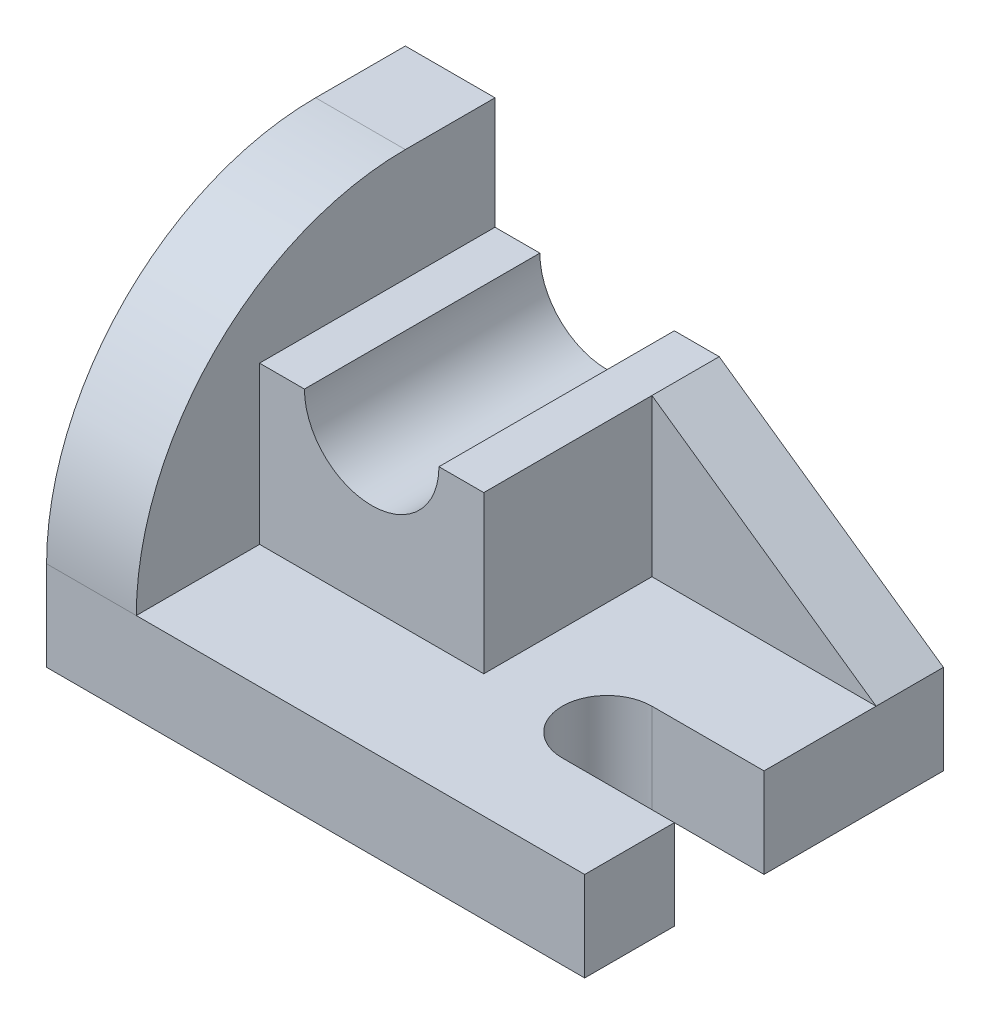
ISO-10303-21;
HEADER;
FILE_DESCRIPTION(('STEP AP214'),'2;1');
FILE_NAME('part.step','',(''),(''),'','','');
FILE_SCHEMA(('AUTOMOTIVE_DESIGN { 1 0 10303 214 1 1 1 1 }'));
ENDSEC;
DATA;
#1=APPLICATION_CONTEXT('core data for automotive mechanical design processes');
#2=APPLICATION_PROTOCOL_DEFINITION('international standard','automotive_design',2000,#1);
#3=PRODUCT_CONTEXT('',#1,'mechanical');
#4=PRODUCT('Part','Part','',(#3));
#5=PRODUCT_RELATED_PRODUCT_CATEGORY('part','',(#4));
#6=PRODUCT_DEFINITION_FORMATION('','',#4);
#7=PRODUCT_DEFINITION_CONTEXT('part definition',#1,'design');
#8=PRODUCT_DEFINITION('design','',#6,#7);
#9=PRODUCT_DEFINITION_SHAPE('','',#8);
#10=(LENGTH_UNIT() NAMED_UNIT(*) SI_UNIT(.MILLI.,.METRE.));
#11=(NAMED_UNIT(*) PLANE_ANGLE_UNIT() SI_UNIT($,.RADIAN.));
#12=(NAMED_UNIT(*) SI_UNIT($,.STERADIAN.) SOLID_ANGLE_UNIT());
#13=UNCERTAINTY_MEASURE_WITH_UNIT(LENGTH_MEASURE(1.E-05),#10,'distance_accuracy_value','');
#14=(GEOMETRIC_REPRESENTATION_CONTEXT(3) GLOBAL_UNCERTAINTY_ASSIGNED_CONTEXT((#13)) GLOBAL_UNIT_ASSIGNED_CONTEXT((#10,
#11,#12)) REPRESENTATION_CONTEXT('',''));
#15=CARTESIAN_POINT('',(0.,0.,0.));
#16=DIRECTION('',(0.,0.,1.));
#17=DIRECTION('',(1.,0.,0.));
#18=AXIS2_PLACEMENT_3D('',#15,#16,#17);
#19=CARTESIAN_POINT('',(0.,44.,0.));
#20=DIRECTION('',(0.,1.,0.));
#21=DIRECTION('',(0.,0.,1.));
#22=AXIS2_PLACEMENT_3D('',#19,#20,#21);
#23=PLANE('',#22);
#24=DIRECTION('',(0.,0.,1.));
#25=VECTOR('',#24,1.);
#26=CARTESIAN_POINT('',(24.,44.,-68.));
#27=LINE('',#26,#25);
#28=CARTESIAN_POINT('',(24.,44.,-64.));
#29=VERTEX_POINT('',#28);
#30=CARTESIAN_POINT('',(24.,44.,-22.));
#31=VERTEX_POINT('',#30);
#32=EDGE_CURVE('E11',#29,#31,#27,.T.);
#33=ORIENTED_EDGE('',*,*,#32,.F.);
#34=DIRECTION('',(-1.,0.,0.));
#35=VECTOR('',#34,1.);
#36=CARTESIAN_POINT('',(16.,44.,-64.));
#37=LINE('',#36,#35);
#38=CARTESIAN_POINT('',(16.,44.,-64.));
#39=VERTEX_POINT('',#38);
#40=EDGE_CURVE('E195',#29,#39,#37,.T.);
#41=ORIENTED_EDGE('',*,*,#40,.T.);
#42=DIRECTION('',(0.,0.,1.));
#43=VECTOR('',#42,1.);
#44=CARTESIAN_POINT('',(16.,44.,-64.));
#45=LINE('',#44,#43);
#46=CARTESIAN_POINT('',(16.,44.,-22.));
#47=VERTEX_POINT('',#46);
#48=EDGE_CURVE('E214',#39,#47,#45,.T.);
#49=ORIENTED_EDGE('',*,*,#48,.T.);
#50=DIRECTION('',(1.,0.,0.));
#51=VECTOR('',#50,1.);
#52=CARTESIAN_POINT('',(16.,44.,-22.));
#53=LINE('',#52,#51);
#54=EDGE_CURVE('E196',#47,#31,#53,.T.);
#55=ORIENTED_EDGE('',*,*,#54,.T.);
#56=EDGE_LOOP('',(#33,#41,#49,#55));
#57=FACE_BOUND('',#56,.T.);
#58=ADVANCED_FACE('F45',(#57),#23,.T.);
#59=CARTESIAN_POINT('',(0.,16.,0.));
#60=DIRECTION('',(0.,-1.,0.));
#61=DIRECTION('',(0.,0.,-1.));
#62=AXIS2_PLACEMENT_3D('',#59,#60,#61);
#63=PLANE('',#62);
#64=DIRECTION('',(0.,0.,-1.));
#65=VECTOR('',#64,1.);
#66=CARTESIAN_POINT('',(96.,16.,0.));
#67=LINE('',#66,#65);
#68=CARTESIAN_POINT('',(96.,16.,-32.));
#69=VERTEX_POINT('',#68);
#70=CARTESIAN_POINT('',(96.,16.,-52.));
#71=VERTEX_POINT('',#70);
#72=EDGE_CURVE('E292',#69,#71,#67,.T.);
#73=ORIENTED_EDGE('',*,*,#72,.T.);
#74=DIRECTION('',(-1.,0.,0.));
#75=VECTOR('',#74,1.);
#76=CARTESIAN_POINT('',(56.,16.,-52.));
#77=LINE('',#76,#75);
#78=CARTESIAN_POINT('',(56.,16.,-52.));
#79=VERTEX_POINT('',#78);
#80=EDGE_CURVE('E174',#71,#79,#77,.T.);
#81=ORIENTED_EDGE('',*,*,#80,.T.);
#82=DIRECTION('',(0.,0.,-1.));
#83=VECTOR('',#82,1.);
#84=CARTESIAN_POINT('',(56.,16.,-64.));
#85=LINE('',#84,#83);
#86=CARTESIAN_POINT('',(56.,16.,-22.));
#87=VERTEX_POINT('',#86);
#88=EDGE_CURVE('E68',#87,#79,#85,.T.);
#89=ORIENTED_EDGE('',*,*,#88,.F.);
#90=DIRECTION('',(1.,0.,0.));
#91=VECTOR('',#90,1.);
#92=CARTESIAN_POINT('',(16.,16.,-22.));
#93=LINE('',#92,#91);
#94=CARTESIAN_POINT('',(16.,16.,-22.));
#95=VERTEX_POINT('',#94);
#96=EDGE_CURVE('E208',#95,#87,#93,.T.);
#97=ORIENTED_EDGE('',*,*,#96,.F.);
#98=DIRECTION('',(0.,0.,1.));
#99=VECTOR('',#98,1.);
#100=CARTESIAN_POINT('',(16.,16.,0.));
#101=LINE('',#100,#99);
#102=CARTESIAN_POINT('',(16.,16.,0.));
#103=VERTEX_POINT('',#102);
#104=EDGE_CURVE('E246',#95,#103,#101,.T.);
#105=ORIENTED_EDGE('',*,*,#104,.T.);
#106=DIRECTION('',(1.,0.,0.));
#107=VECTOR('',#106,1.);
#108=CARTESIAN_POINT('',(0.,16.,0.));
#109=LINE('',#108,#107);
#110=CARTESIAN_POINT('',(96.,16.,0.));
#111=VERTEX_POINT('',#110);
#112=EDGE_CURVE('E293',#103,#111,#109,.T.);
#113=ORIENTED_EDGE('',*,*,#112,.T.);
#114=CARTESIAN_POINT('',(96.,16.,-16.));
#115=VERTEX_POINT('',#114);
#116=EDGE_CURVE('E294',#111,#115,#67,.T.);
#117=ORIENTED_EDGE('',*,*,#116,.T.);
#118=DIRECTION('',(1.,0.,0.));
#119=VECTOR('',#118,1.);
#120=CARTESIAN_POINT('',(96.,16.,-16.));
#121=LINE('',#120,#119);
#122=CARTESIAN_POINT('',(76.,16.,-16.));
#123=VERTEX_POINT('',#122);
#124=EDGE_CURVE('E257',#123,#115,#121,.T.);
#125=ORIENTED_EDGE('',*,*,#124,.F.);
#126=CARTESIAN_POINT('',(76.,16.,-24.));
#127=DIRECTION('',(0.,1.,0.));
#128=DIRECTION('',(0.,0.,1.));
#129=AXIS2_PLACEMENT_3D('',#126,#127,#128);
#130=CIRCLE('',#129,8.);
#131=CARTESIAN_POINT('',(76.,16.,-32.));
#132=VERTEX_POINT('',#131);
#133=EDGE_CURVE('E269',#132,#123,#130,.T.);
#134=ORIENTED_EDGE('',*,*,#133,.F.);
#135=DIRECTION('',(-1.,0.,0.));
#136=VECTOR('',#135,1.);
#137=CARTESIAN_POINT('',(96.,16.,-32.));
#138=LINE('',#137,#136);
#139=EDGE_CURVE('E251',#69,#132,#138,.T.);
#140=ORIENTED_EDGE('',*,*,#139,.F.);
#141=EDGE_LOOP('',(#73,#81,#89,#97,#105,#113,#117,#125,#134,#140));
#142=FACE_BOUND('',#141,.T.);
#143=ADVANCED_FACE('F363',(#142),#63,.F.);
#144=CARTESIAN_POINT('',(16.,16.,-48.));
#145=DIRECTION('',(1.,0.,0.));
#146=DIRECTION('',(0.,0.,-1.));
#147=AXIS2_PLACEMENT_3D('',#144,#145,#146);
#148=PLANE('',#147);
#149=ORIENTED_EDGE('',*,*,#104,.F.);
#150=DIRECTION('',(0.,-1.,0.));
#151=VECTOR('',#150,1.);
#152=CARTESIAN_POINT('',(16.,44.,-22.));
#153=LINE('',#152,#151);
#154=EDGE_CURVE('E217',#47,#95,#153,.T.);
#155=ORIENTED_EDGE('',*,*,#154,.F.);
#156=ORIENTED_EDGE('',*,*,#48,.F.);
#157=DIRECTION('',(0.,-1.,0.));
#158=VECTOR('',#157,1.);
#159=CARTESIAN_POINT('',(16.,0.,-64.));
#160=LINE('',#159,#158);
#161=CARTESIAN_POINT('',(16.,64.,-64.));
#162=VERTEX_POINT('',#161);
#163=EDGE_CURVE('E222',#162,#39,#160,.T.);
#164=ORIENTED_EDGE('',*,*,#163,.F.);
#165=DIRECTION('',(0.,0.,-1.));
#166=VECTOR('',#165,1.);
#167=CARTESIAN_POINT('',(16.,64.,-64.));
#168=LINE('',#167,#166);
#169=CARTESIAN_POINT('',(16.,64.,-48.0000000000003));
#170=VERTEX_POINT('',#169);
#171=EDGE_CURVE('E231',#170,#162,#168,.T.);
#172=ORIENTED_EDGE('',*,*,#171,.F.);
#173=CARTESIAN_POINT('',(16.,16.,-48.));
#174=DIRECTION('',(-1.,0.,0.));
#175=DIRECTION('',(0.,0.,-1.));
#176=AXIS2_PLACEMENT_3D('',#173,#174,#175);
#177=CIRCLE('',#176,48.);
#178=EDGE_CURVE('E226',#103,#170,#177,.T.);
#179=ORIENTED_EDGE('',*,*,#178,.F.);
#180=EDGE_LOOP('',(#149,#155,#156,#164,#172,#179));
#181=FACE_BOUND('',#180,.T.);
#182=ADVANCED_FACE('F347',(#181),#148,.T.);
#183=CARTESIAN_POINT('',(96.,16.,0.));
#184=DIRECTION('',(-1.,0.,0.));
#185=DIRECTION('',(0.,0.,1.));
#186=AXIS2_PLACEMENT_3D('',#183,#184,#185);
#187=PLANE('',#186);
#188=DIRECTION('',(0.,0.,-1.));
#189=VECTOR('',#188,1.);
#190=CARTESIAN_POINT('',(96.,0.,0.));
#191=LINE('',#190,#189);
#192=CARTESIAN_POINT('',(96.,0.,0.));
#193=VERTEX_POINT('',#192);
#194=CARTESIAN_POINT('',(96.,0.,-16.));
#195=VERTEX_POINT('',#194);
#196=EDGE_CURVE('E306',#193,#195,#191,.T.);
#197=ORIENTED_EDGE('',*,*,#196,.T.);
#198=DIRECTION('',(0.,1.,0.));
#199=VECTOR('',#198,1.);
#200=CARTESIAN_POINT('',(96.,0.,-16.));
#201=LINE('',#200,#199);
#202=EDGE_CURVE('E275',#195,#115,#201,.T.);
#203=ORIENTED_EDGE('',*,*,#202,.T.);
#204=ORIENTED_EDGE('',*,*,#116,.F.);
#205=DIRECTION('',(0.,-1.,0.));
#206=VECTOR('',#205,1.);
#207=CARTESIAN_POINT('',(96.,16.,0.));
#208=LINE('',#207,#206);
#209=EDGE_CURVE('E320',#111,#193,#208,.T.);
#210=ORIENTED_EDGE('',*,*,#209,.T.);
#211=EDGE_LOOP('',(#197,#203,#204,#210));
#212=FACE_BOUND('',#211,.T.);
#213=ADVANCED_FACE('F373',(#212),#187,.F.);
#214=CARTESIAN_POINT('',(0.,16.,0.));
#215=DIRECTION('',(1.,0.,0.));
#216=DIRECTION('',(0.,0.,-1.));
#217=AXIS2_PLACEMENT_3D('',#214,#215,#216);
#218=PLANE('',#217);
#219=DIRECTION('',(0.,0.,1.));
#220=VECTOR('',#219,1.);
#221=CARTESIAN_POINT('',(0.,0.,0.));
#222=LINE('',#221,#220);
#223=CARTESIAN_POINT('',(0.,0.,-64.));
#224=VERTEX_POINT('',#223);
#225=CARTESIAN_POINT('',(0.,0.,0.));
#226=VERTEX_POINT('',#225);
#227=EDGE_CURVE('E279',#224,#226,#222,.T.);
#228=ORIENTED_EDGE('',*,*,#227,.T.);
#229=DIRECTION('',(0.,-1.,0.));
#230=VECTOR('',#229,1.);
#231=CARTESIAN_POINT('',(0.,16.,0.));
#232=LINE('',#231,#230);
#233=CARTESIAN_POINT('',(0.,15.9999999999997,0.));
#234=VERTEX_POINT('',#233);
#235=EDGE_CURVE('E324',#234,#226,#232,.T.);
#236=ORIENTED_EDGE('',*,*,#235,.F.);
#237=CARTESIAN_POINT('',(0.,16.,-48.));
#238=DIRECTION('',(-1.,0.,0.));
#239=DIRECTION('',(0.,0.,-1.));
#240=AXIS2_PLACEMENT_3D('',#237,#238,#239);
#241=CIRCLE('',#240,48.);
#242=CARTESIAN_POINT('',(0.,64.,-48.0000000000003));
#243=VERTEX_POINT('',#242);
#244=EDGE_CURVE('E221',#234,#243,#241,.T.);
#245=ORIENTED_EDGE('',*,*,#244,.T.);
#246=DIRECTION('',(0.,0.,-1.));
#247=VECTOR('',#246,1.);
#248=CARTESIAN_POINT('',(0.,64.,-64.));
#249=LINE('',#248,#247);
#250=CARTESIAN_POINT('',(0.,64.,-64.));
#251=VERTEX_POINT('',#250);
#252=EDGE_CURVE('E227',#243,#251,#249,.T.);
#253=ORIENTED_EDGE('',*,*,#252,.T.);
#254=DIRECTION('',(0.,-1.,0.));
#255=VECTOR('',#254,1.);
#256=CARTESIAN_POINT('',(0.,16.,-64.));
#257=LINE('',#256,#255);
#258=EDGE_CURVE('E298',#251,#224,#257,.T.);
#259=ORIENTED_EDGE('',*,*,#258,.T.);
#260=EDGE_LOOP('',(#228,#236,#245,#253,#259));
#261=FACE_BOUND('',#260,.T.);
#262=ADVANCED_FACE('F47',(#261),#218,.F.);
#263=CARTESIAN_POINT('',(0.,16.,0.));
#264=DIRECTION('',(0.,0.,-1.));
#265=DIRECTION('',(-1.,0.,0.));
#266=AXIS2_PLACEMENT_3D('',#263,#264,#265);
#267=PLANE('',#266);
#268=ORIENTED_EDGE('',*,*,#112,.F.);
#269=EDGE_CURVE('E288',#234,#103,#109,.T.);
#270=ORIENTED_EDGE('',*,*,#269,.F.);
#271=ORIENTED_EDGE('',*,*,#235,.T.);
#272=DIRECTION('',(1.,0.,0.));
#273=VECTOR('',#272,1.);
#274=CARTESIAN_POINT('',(0.,0.,0.));
#275=LINE('',#274,#273);
#276=EDGE_CURVE('E302',#226,#193,#275,.T.);
#277=ORIENTED_EDGE('',*,*,#276,.T.);
#278=ORIENTED_EDGE('',*,*,#209,.F.);
#279=EDGE_LOOP('',(#268,#270,#271,#277,#278));
#280=FACE_BOUND('',#279,.T.);
#281=ADVANCED_FACE('F389',(#280),#267,.F.);
#282=ORIENTED_EDGE('',*,*,#72,.F.);
#283=DIRECTION('',(0.,1.,0.));
#284=VECTOR('',#283,1.);
#285=CARTESIAN_POINT('',(96.,0.,-32.));
#286=LINE('',#285,#284);
#287=CARTESIAN_POINT('',(96.,0.,-32.));
#288=VERTEX_POINT('',#287);
#289=EDGE_CURVE('E265',#288,#69,#286,.T.);
#290=ORIENTED_EDGE('',*,*,#289,.F.);
#291=CARTESIAN_POINT('',(96.,0.,-64.));
#292=VERTEX_POINT('',#291);
#293=EDGE_CURVE('E305',#288,#292,#191,.T.);
#294=ORIENTED_EDGE('',*,*,#293,.T.);
#295=DIRECTION('',(0.,-1.,0.));
#296=VECTOR('',#295,1.);
#297=CARTESIAN_POINT('',(96.,16.,-64.));
#298=LINE('',#297,#296);
#299=CARTESIAN_POINT('',(96.,16.,-64.));
#300=VERTEX_POINT('',#299);
#301=EDGE_CURVE('E316',#300,#292,#298,.T.);
#302=ORIENTED_EDGE('',*,*,#301,.F.);
#303=DIRECTION('',(0.,0.,-1.));
#304=VECTOR('',#303,1.);
#305=CARTESIAN_POINT('',(96.,16.,-52.));
#306=LINE('',#305,#304);
#307=EDGE_CURVE('E173',#71,#300,#306,.T.);
#308=ORIENTED_EDGE('',*,*,#307,.F.);
#309=EDGE_LOOP('',(#282,#290,#294,#302,#308));
#310=FACE_BOUND('',#309,.T.);
#311=ADVANCED_FACE('F388',(#310),#187,.F.);
#312=CARTESIAN_POINT('',(0.,16.,-64.));
#313=DIRECTION('',(0.,0.,1.));
#314=DIRECTION('',(1.,0.,0.));
#315=AXIS2_PLACEMENT_3D('',#312,#313,#314);
#316=PLANE('',#315);
#317=ORIENTED_EDGE('',*,*,#40,.F.);
#318=CARTESIAN_POINT('',(36.,44.,-64.));
#319=DIRECTION('',(0.,0.,1.));
#320=DIRECTION('',(1.,0.,0.));
#321=AXIS2_PLACEMENT_3D('',#318,#319,#320);
#322=CIRCLE('',#321,12.);
#323=CARTESIAN_POINT('',(48.,44.,-64.));
#324=VERTEX_POINT('',#323);
#325=EDGE_CURVE('E211',#29,#324,#322,.T.);
#326=ORIENTED_EDGE('',*,*,#325,.T.);
#327=CARTESIAN_POINT('',(56.,44.,-64.));
#328=VERTEX_POINT('',#327);
#329=EDGE_CURVE('E200',#328,#324,#37,.T.);
#330=ORIENTED_EDGE('',*,*,#329,.F.);
#331=DIRECTION('',(0.81923192051904,-0.573462344363329,0.));
#332=VECTOR('',#331,1.);
#333=CARTESIAN_POINT('',(56.,44.,-64.));
#334=LINE('',#333,#332);
#335=EDGE_CURVE('E167',#328,#300,#334,.T.);
#336=ORIENTED_EDGE('',*,*,#335,.T.);
#337=ORIENTED_EDGE('',*,*,#301,.T.);
#338=DIRECTION('',(-1.,0.,0.));
#339=VECTOR('',#338,1.);
#340=CARTESIAN_POINT('',(0.,0.,-64.));
#341=LINE('',#340,#339);
#342=EDGE_CURVE('E310',#292,#224,#341,.T.);
#343=ORIENTED_EDGE('',*,*,#342,.T.);
#344=ORIENTED_EDGE('',*,*,#258,.F.);
#345=DIRECTION('',(-1.,0.,0.));
#346=VECTOR('',#345,1.);
#347=CARTESIAN_POINT('',(16.,64.,-64.));
#348=LINE('',#347,#346);
#349=EDGE_CURVE('E242',#162,#251,#348,.T.);
#350=ORIENTED_EDGE('',*,*,#349,.F.);
#351=ORIENTED_EDGE('',*,*,#163,.T.);
#352=EDGE_LOOP('',(#317,#326,#330,#336,#337,#343,#344,#350,#351));
#353=FACE_BOUND('',#352,.T.);
#354=ADVANCED_FACE('F333',(#353),#316,.F.);
#355=CARTESIAN_POINT('',(0.,0.,0.));
#356=DIRECTION('',(0.,-1.,0.));
#357=DIRECTION('',(0.,0.,-1.));
#358=AXIS2_PLACEMENT_3D('',#355,#356,#357);
#359=PLANE('',#358);
#360=ORIENTED_EDGE('',*,*,#196,.F.);
#361=ORIENTED_EDGE('',*,*,#276,.F.);
#362=ORIENTED_EDGE('',*,*,#227,.F.);
#363=ORIENTED_EDGE('',*,*,#342,.F.);
#364=ORIENTED_EDGE('',*,*,#293,.F.);
#365=DIRECTION('',(-1.,0.,0.));
#366=VECTOR('',#365,1.);
#367=CARTESIAN_POINT('',(96.,0.,-32.));
#368=LINE('',#367,#366);
#369=CARTESIAN_POINT('',(76.,0.,-32.));
#370=VERTEX_POINT('',#369);
#371=EDGE_CURVE('E252',#288,#370,#368,.T.);
#372=ORIENTED_EDGE('',*,*,#371,.T.);
#373=CARTESIAN_POINT('',(76.,0.,-24.));
#374=DIRECTION('',(0.,1.,0.));
#375=DIRECTION('',(0.,0.,1.));
#376=AXIS2_PLACEMENT_3D('',#373,#374,#375);
#377=CIRCLE('',#376,8.);
#378=CARTESIAN_POINT('',(76.,0.,-16.));
#379=VERTEX_POINT('',#378);
#380=EDGE_CURVE('E256',#370,#379,#377,.T.);
#381=ORIENTED_EDGE('',*,*,#380,.T.);
#382=DIRECTION('',(1.,0.,0.));
#383=VECTOR('',#382,1.);
#384=CARTESIAN_POINT('',(96.,0.,-16.));
#385=LINE('',#384,#383);
#386=EDGE_CURVE('E261',#379,#195,#385,.T.);
#387=ORIENTED_EDGE('',*,*,#386,.T.);
#388=EDGE_LOOP('',(#360,#361,#362,#363,#364,#372,#381,#387));
#389=FACE_BOUND('',#388,.T.);
#390=ADVANCED_FACE('F381',(#389),#359,.T.);
#391=CARTESIAN_POINT('',(96.,0.,-16.));
#392=DIRECTION('',(0.,0.,1.));
#393=DIRECTION('',(1.,0.,0.));
#394=AXIS2_PLACEMENT_3D('',#391,#392,#393);
#395=PLANE('',#394);
#396=ORIENTED_EDGE('',*,*,#124,.T.);
#397=ORIENTED_EDGE('',*,*,#202,.F.);
#398=ORIENTED_EDGE('',*,*,#386,.F.);
#399=DIRECTION('',(0.,1.,0.));
#400=VECTOR('',#399,1.);
#401=CARTESIAN_POINT('',(76.,0.,-16.));
#402=LINE('',#401,#400);
#403=EDGE_CURVE('E280',#379,#123,#402,.T.);
#404=ORIENTED_EDGE('',*,*,#403,.T.);
#405=EDGE_LOOP('',(#396,#397,#398,#404));
#406=FACE_BOUND('',#405,.T.);
#407=ADVANCED_FACE('F384',(#406),#395,.F.);
#408=CARTESIAN_POINT('',(76.,0.,-24.));
#409=DIRECTION('',(0.,1.,0.));
#410=DIRECTION('',(0.,0.,1.));
#411=AXIS2_PLACEMENT_3D('',#408,#409,#410);
#412=CYLINDRICAL_SURFACE('',#411,8.);
#413=ORIENTED_EDGE('',*,*,#133,.T.);
#414=ORIENTED_EDGE('',*,*,#403,.F.);
#415=ORIENTED_EDGE('',*,*,#380,.F.);
#416=DIRECTION('',(0.,1.,0.));
#417=VECTOR('',#416,1.);
#418=CARTESIAN_POINT('',(76.,0.,-32.));
#419=LINE('',#418,#417);
#420=EDGE_CURVE('E283',#370,#132,#419,.T.);
#421=ORIENTED_EDGE('',*,*,#420,.T.);
#422=EDGE_LOOP('',(#413,#414,#415,#421));
#423=FACE_BOUND('',#422,.T.);
#424=ADVANCED_FACE('F412',(#423),#412,.F.);
#425=CARTESIAN_POINT('',(96.,0.,-32.));
#426=DIRECTION('',(0.,0.,-1.));
#427=DIRECTION('',(-1.,0.,0.));
#428=AXIS2_PLACEMENT_3D('',#425,#426,#427);
#429=PLANE('',#428);
#430=ORIENTED_EDGE('',*,*,#139,.T.);
#431=ORIENTED_EDGE('',*,*,#420,.F.);
#432=ORIENTED_EDGE('',*,*,#371,.F.);
#433=ORIENTED_EDGE('',*,*,#289,.T.);
#434=EDGE_LOOP('',(#430,#431,#432,#433));
#435=FACE_BOUND('',#434,.T.);
#436=ADVANCED_FACE('F379',(#435),#429,.F.);
#437=CARTESIAN_POINT('',(16.,64.,-64.));
#438=DIRECTION('',(0.,1.,0.));
#439=DIRECTION('',(0.,0.,1.));
#440=AXIS2_PLACEMENT_3D('',#437,#438,#439);
#441=PLANE('',#440);
#442=ORIENTED_EDGE('',*,*,#252,.F.);
#443=DIRECTION('',(-1.,0.,0.));
#444=VECTOR('',#443,1.);
#445=CARTESIAN_POINT('',(16.,64.,-48.0000000000003));
#446=LINE('',#445,#444);
#447=EDGE_CURVE('E235',#170,#243,#446,.T.);
#448=ORIENTED_EDGE('',*,*,#447,.F.);
#449=ORIENTED_EDGE('',*,*,#171,.T.);
#450=ORIENTED_EDGE('',*,*,#349,.T.);
#451=EDGE_LOOP('',(#442,#448,#449,#450));
#452=FACE_BOUND('',#451,.T.);
#453=ADVANCED_FACE('F351',(#452),#441,.T.);
#454=CARTESIAN_POINT('',(16.,16.,-48.));
#455=DIRECTION('',(-1.,0.,0.));
#456=DIRECTION('',(0.,0.,1.));
#457=AXIS2_PLACEMENT_3D('',#454,#455,#456);
#458=CYLINDRICAL_SURFACE('',#457,48.);
#459=ORIENTED_EDGE('',*,*,#244,.F.);
#460=ORIENTED_EDGE('',*,*,#269,.T.);
#461=ORIENTED_EDGE('',*,*,#178,.T.);
#462=ORIENTED_EDGE('',*,*,#447,.T.);
#463=EDGE_LOOP('',(#459,#460,#461,#462));
#464=FACE_BOUND('',#463,.T.);
#465=ADVANCED_FACE('F357',(#464),#458,.T.);
#466=CARTESIAN_POINT('',(16.,44.,-22.));
#467=DIRECTION('',(0.,0.,-1.));
#468=DIRECTION('',(-1.,0.,0.));
#469=AXIS2_PLACEMENT_3D('',#466,#467,#468);
#470=PLANE('',#469);
#471=CARTESIAN_POINT('',(48.,44.,-22.));
#472=VERTEX_POINT('',#471);
#473=CARTESIAN_POINT('',(56.,44.,-22.));
#474=VERTEX_POINT('',#473);
#475=EDGE_CURVE('E192',#472,#474,#53,.T.);
#476=ORIENTED_EDGE('',*,*,#475,.F.);
#477=CARTESIAN_POINT('',(36.,44.,-22.));
#478=DIRECTION('',(0.,0.,1.));
#479=DIRECTION('',(1.,0.,0.));
#480=AXIS2_PLACEMENT_3D('',#477,#478,#479);
#481=CIRCLE('',#480,12.);
#482=EDGE_CURVE('E60',#31,#472,#481,.T.);
#483=ORIENTED_EDGE('',*,*,#482,.F.);
#484=ORIENTED_EDGE('',*,*,#54,.F.);
#485=ORIENTED_EDGE('',*,*,#154,.T.);
#486=ORIENTED_EDGE('',*,*,#96,.T.);
#487=DIRECTION('',(0.,-1.,0.));
#488=VECTOR('',#487,1.);
#489=CARTESIAN_POINT('',(56.,44.,-22.));
#490=LINE('',#489,#488);
#491=EDGE_CURVE('E207',#474,#87,#490,.T.);
#492=ORIENTED_EDGE('',*,*,#491,.F.);
#493=EDGE_LOOP('',(#476,#483,#484,#485,#486,#492));
#494=FACE_BOUND('',#493,.T.);
#495=ADVANCED_FACE('F361',(#494),#470,.F.);
#496=CARTESIAN_POINT('',(56.,44.,-64.));
#497=DIRECTION('',(-1.,0.,0.));
#498=DIRECTION('',(0.,0.,1.));
#499=AXIS2_PLACEMENT_3D('',#496,#497,#498);
#500=PLANE('',#499);
#501=ORIENTED_EDGE('',*,*,#88,.T.);
#502=DIRECTION('',(0.,1.,0.));
#503=VECTOR('',#502,1.);
#504=CARTESIAN_POINT('',(56.,44.,-52.));
#505=LINE('',#504,#503);
#506=CARTESIAN_POINT('',(56.,44.,-52.));
#507=VERTEX_POINT('',#506);
#508=EDGE_CURVE('E179',#79,#507,#505,.T.);
#509=ORIENTED_EDGE('',*,*,#508,.T.);
#510=DIRECTION('',(0.,0.,-1.));
#511=VECTOR('',#510,1.);
#512=CARTESIAN_POINT('',(56.,44.,-64.));
#513=LINE('',#512,#511);
#514=EDGE_CURVE('E187',#474,#507,#513,.T.);
#515=ORIENTED_EDGE('',*,*,#514,.F.);
#516=ORIENTED_EDGE('',*,*,#491,.T.);
#517=EDGE_LOOP('',(#501,#509,#515,#516));
#518=FACE_BOUND('',#517,.T.);
#519=ADVANCED_FACE('F185',(#518),#500,.F.);
#520=DIRECTION('',(0.,0.,1.));
#521=VECTOR('',#520,1.);
#522=CARTESIAN_POINT('',(48.,44.,-68.));
#523=LINE('',#522,#521);
#524=EDGE_CURVE('E54',#472,#324,#523,.F.);
#525=ORIENTED_EDGE('',*,*,#524,.F.);
#526=ORIENTED_EDGE('',*,*,#475,.T.);
#527=ORIENTED_EDGE('',*,*,#514,.T.);
#528=DIRECTION('',(0.,0.,-1.));
#529=VECTOR('',#528,1.);
#530=CARTESIAN_POINT('',(56.,44.,-52.));
#531=LINE('',#530,#529);
#532=EDGE_CURVE('E161',#507,#328,#531,.T.);
#533=ORIENTED_EDGE('',*,*,#532,.T.);
#534=ORIENTED_EDGE('',*,*,#329,.T.);
#535=EDGE_LOOP('',(#525,#526,#527,#533,#534));
#536=FACE_BOUND('',#535,.T.);
#537=ADVANCED_FACE('F190',(#536),#23,.T.);
#538=CARTESIAN_POINT('',(36.,44.,-68.));
#539=DIRECTION('',(0.,0.,1.));
#540=DIRECTION('',(1.,0.,0.));
#541=AXIS2_PLACEMENT_3D('',#538,#539,#540);
#542=CYLINDRICAL_SURFACE('',#541,12.);
#543=ORIENTED_EDGE('',*,*,#32,.T.);
#544=ORIENTED_EDGE('',*,*,#482,.T.);
#545=ORIENTED_EDGE('',*,*,#524,.T.);
#546=ORIENTED_EDGE('',*,*,#325,.F.);
#547=EDGE_LOOP('',(#543,#544,#545,#546));
#548=FACE_BOUND('',#547,.T.);
#549=ADVANCED_FACE('F329',(#548),#542,.F.);
#550=CARTESIAN_POINT('',(56.,44.,-52.));
#551=DIRECTION('',(0.573462344363329,0.81923192051904,0.));
#552=DIRECTION('',(-0.81923192051904,0.573462344363329,0.));
#553=AXIS2_PLACEMENT_3D('',#550,#551,#552);
#554=PLANE('',#553);
#555=ORIENTED_EDGE('',*,*,#335,.F.);
#556=ORIENTED_EDGE('',*,*,#532,.F.);
#557=DIRECTION('',(0.81923192051904,-0.573462344363329,0.));
#558=VECTOR('',#557,1.);
#559=CARTESIAN_POINT('',(56.,44.,-52.));
#560=LINE('',#559,#558);
#561=EDGE_CURVE('E164',#507,#71,#560,.T.);
#562=ORIENTED_EDGE('',*,*,#561,.T.);
#563=ORIENTED_EDGE('',*,*,#307,.T.);
#564=EDGE_LOOP('',(#555,#556,#562,#563));
#565=FACE_BOUND('',#564,.T.);
#566=ADVANCED_FACE('F163',(#565),#554,.T.);
#567=CARTESIAN_POINT('',(0.,0.,-52.));
#568=DIRECTION('',(0.,0.,1.));
#569=DIRECTION('',(1.,0.,0.));
#570=AXIS2_PLACEMENT_3D('',#567,#568,#569);
#571=PLANE('',#570);
#572=ORIENTED_EDGE('',*,*,#508,.F.);
#573=ORIENTED_EDGE('',*,*,#80,.F.);
#574=ORIENTED_EDGE('',*,*,#561,.F.);
#575=EDGE_LOOP('',(#572,#573,#574));
#576=FACE_BOUND('',#575,.T.);
#577=ADVANCED_FACE('F178',(#576),#571,.T.);
#578=CLOSED_SHELL('',(#58,#143,#182,#213,#262,#281,#311,#354,#390,#407,#424,#436,#453,#465,#495,
#519,#537,#549,#566,#577));
#579=MANIFOLD_SOLID_BREP('B2',#578);
#580=ADVANCED_BREP_SHAPE_REPRESENTATION('',(#18,#579),#14);
#581=SHAPE_DEFINITION_REPRESENTATION(#9,#580);
ENDSEC;
END-ISO-10303-21;
